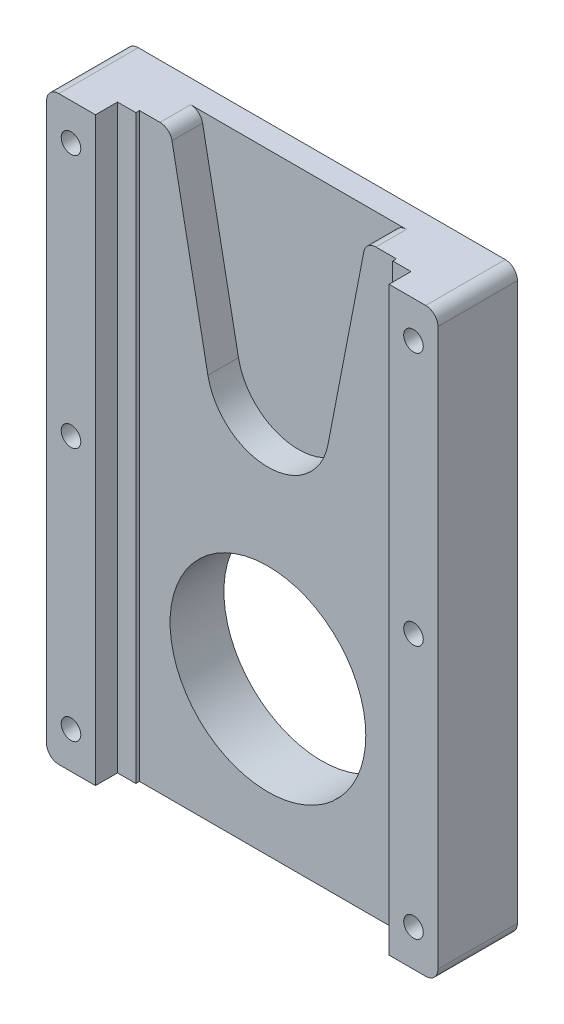
ISO-10303-21;
HEADER;
FILE_DESCRIPTION(('STEP AP214'),'2;1');
FILE_NAME('part.step','',(''),(''),'','','');
FILE_SCHEMA(('AUTOMOTIVE_DESIGN { 1 0 10303 214 1 1 1 1 }'));
ENDSEC;
DATA;
#1=APPLICATION_CONTEXT('core data for automotive mechanical design processes');
#2=APPLICATION_PROTOCOL_DEFINITION('international standard','automotive_design',2000,#1);
#3=PRODUCT_CONTEXT('',#1,'mechanical');
#4=PRODUCT('Part','Part','',(#3));
#5=PRODUCT_RELATED_PRODUCT_CATEGORY('part','',(#4));
#6=PRODUCT_DEFINITION_FORMATION('','',#4);
#7=PRODUCT_DEFINITION_CONTEXT('part definition',#1,'design');
#8=PRODUCT_DEFINITION('design','',#6,#7);
#9=PRODUCT_DEFINITION_SHAPE('','',#8);
#10=(LENGTH_UNIT() NAMED_UNIT(*) SI_UNIT(.MILLI.,.METRE.));
#11=(NAMED_UNIT(*) PLANE_ANGLE_UNIT() SI_UNIT($,.RADIAN.));
#12=(NAMED_UNIT(*) SI_UNIT($,.STERADIAN.) SOLID_ANGLE_UNIT());
#13=UNCERTAINTY_MEASURE_WITH_UNIT(LENGTH_MEASURE(1.E-05),#10,'distance_accuracy_value','');
#14=(GEOMETRIC_REPRESENTATION_CONTEXT(3) GLOBAL_UNCERTAINTY_ASSIGNED_CONTEXT((#13)) GLOBAL_UNIT_ASSIGNED_CONTEXT((#10,
#11,#12)) REPRESENTATION_CONTEXT('',''));
#15=CARTESIAN_POINT('',(0.,0.,0.));
#16=DIRECTION('',(0.,0.,1.));
#17=DIRECTION('',(1.,0.,0.));
#18=AXIS2_PLACEMENT_3D('',#15,#16,#17);
#19=CARTESIAN_POINT('',(0.,0.,-12.));
#20=DIRECTION('',(0.,0.,1.));
#21=DIRECTION('',(1.,0.,0.));
#22=AXIS2_PLACEMENT_3D('',#19,#20,#21);
#23=CYLINDRICAL_SURFACE('',#22,16.);
#24=CARTESIAN_POINT('',(0.,0.,-12.));
#25=DIRECTION('',(0.,0.,1.));
#26=DIRECTION('',(1.,0.,0.));
#27=AXIS2_PLACEMENT_3D('',#24,#25,#26);
#28=CIRCLE('',#27,16.);
#29=CARTESIAN_POINT('',(16.,0.,-12.));
#30=VERTEX_POINT('',#29);
#31=EDGE_CURVE('E340',#30,#30,#28,.T.);
#32=ORIENTED_EDGE('',*,*,#31,.F.);
#33=EDGE_LOOP('',(#32));
#34=FACE_BOUND('',#33,.T.);
#35=CARTESIAN_POINT('',(0.,0.,-3.2));
#36=DIRECTION('',(0.,0.,1.));
#37=DIRECTION('',(1.,0.,0.));
#38=AXIS2_PLACEMENT_3D('',#35,#36,#37);
#39=CIRCLE('',#38,16.);
#40=CARTESIAN_POINT('',(16.,0.,-3.2));
#41=VERTEX_POINT('',#40);
#42=EDGE_CURVE('E313',#41,#41,#39,.F.);
#43=ORIENTED_EDGE('',*,*,#42,.F.);
#44=EDGE_LOOP('',(#43));
#45=FACE_BOUND('',#44,.T.);
#46=ADVANCED_FACE('F35',(#34,#45),#23,.F.);
#47=CARTESIAN_POINT('',(0.,0.,-2.6));
#48=DIRECTION('',(0.,0.,1.));
#49=DIRECTION('',(1.,0.,0.));
#50=AXIS2_PLACEMENT_3D('',#47,#48,#49);
#51=PLANE('',#50);
#52=DIRECTION('',(0.,-1.,0.));
#53=VECTOR('',#52,1.);
#54=CARTESIAN_POINT('',(-21.,70.,-2.6));
#55=LINE('',#54,#53);
#56=CARTESIAN_POINT('',(-21.,70.,-2.6));
#57=VERTEX_POINT('',#56);
#58=CARTESIAN_POINT('',(-21.,-25.,-2.6));
#59=VERTEX_POINT('',#58);
#60=EDGE_CURVE('E288',#57,#59,#55,.T.);
#61=ORIENTED_EDGE('',*,*,#60,.F.);
#62=DIRECTION('',(-1.,0.,0.));
#63=VECTOR('',#62,1.);
#64=CARTESIAN_POINT('',(-24.,70.,-2.6));
#65=LINE('',#64,#63);
#66=CARTESIAN_POINT('',(-24.,70.,-2.6));
#67=VERTEX_POINT('',#66);
#68=EDGE_CURVE('E333',#57,#67,#65,.T.);
#69=ORIENTED_EDGE('',*,*,#68,.T.);
#70=DIRECTION('',(0.,-1.,0.));
#71=VECTOR('',#70,1.);
#72=CARTESIAN_POINT('',(-24.,70.,-2.6));
#73=LINE('',#72,#71);
#74=CARTESIAN_POINT('',(-24.,-25.,-2.6));
#75=VERTEX_POINT('',#74);
#76=EDGE_CURVE('E323',#67,#75,#73,.T.);
#77=ORIENTED_EDGE('',*,*,#76,.T.);
#78=DIRECTION('',(1.,0.,0.));
#79=VECTOR('',#78,1.);
#80=CARTESIAN_POINT('',(-24.,-25.,-2.6));
#81=LINE('',#80,#79);
#82=EDGE_CURVE('E327',#75,#59,#81,.T.);
#83=ORIENTED_EDGE('',*,*,#82,.T.);
#84=EDGE_LOOP('',(#61,#69,#77,#83));
#85=FACE_BOUND('',#84,.T.);
#86=ADVANCED_FACE('F450',(#85),#51,.T.);
#87=CARTESIAN_POINT('',(-32.,70.,-12.));
#88=DIRECTION('',(-1.,0.,0.));
#89=DIRECTION('',(0.,-1.,0.));
#90=AXIS2_PLACEMENT_3D('',#87,#88,#89);
#91=PLANE('',#90);
#92=DIRECTION('',(0.,-1.,0.));
#93=VECTOR('',#92,1.);
#94=CARTESIAN_POINT('',(-32.,70.,-12.));
#95=LINE('',#94,#93);
#96=CARTESIAN_POINT('',(-32.,68.,-12.));
#97=VERTEX_POINT('',#96);
#98=CARTESIAN_POINT('',(-32.,-23.,-12.));
#99=VERTEX_POINT('',#98);
#100=EDGE_CURVE('E348',#97,#99,#95,.T.);
#101=ORIENTED_EDGE('',*,*,#100,.T.);
#102=DIRECTION('',(0.,0.,1.));
#103=VECTOR('',#102,1.);
#104=CARTESIAN_POINT('',(-32.,-23.,-12.));
#105=LINE('',#104,#103);
#106=CARTESIAN_POINT('',(-32.,-23.,1.));
#107=VERTEX_POINT('',#106);
#108=EDGE_CURVE('E193',#99,#107,#105,.T.);
#109=ORIENTED_EDGE('',*,*,#108,.T.);
#110=DIRECTION('',(0.,-1.,0.));
#111=VECTOR('',#110,1.);
#112=CARTESIAN_POINT('',(-32.,68.,1.));
#113=LINE('',#112,#111);
#114=CARTESIAN_POINT('',(-32.,68.,1.));
#115=VERTEX_POINT('',#114);
#116=EDGE_CURVE('E197',#115,#107,#113,.T.);
#117=ORIENTED_EDGE('',*,*,#116,.F.);
#118=DIRECTION('',(0.,0.,1.));
#119=VECTOR('',#118,1.);
#120=CARTESIAN_POINT('',(-32.,68.,-12.));
#121=LINE('',#120,#119);
#122=EDGE_CURVE('E184',#115,#97,#121,.F.);
#123=ORIENTED_EDGE('',*,*,#122,.T.);
#124=EDGE_LOOP('',(#101,#109,#117,#123));
#125=FACE_BOUND('',#124,.T.);
#126=ADVANCED_FACE('F198',(#125),#91,.T.);
#127=CARTESIAN_POINT('',(-32.,70.,-12.));
#128=DIRECTION('',(0.,1.,0.));
#129=DIRECTION('',(-1.,0.,0.));
#130=AXIS2_PLACEMENT_3D('',#127,#128,#129);
#131=PLANE('',#130);
#132=DIRECTION('',(-1.,0.,0.));
#133=VECTOR('',#132,1.);
#134=CARTESIAN_POINT('',(-16.,70.,-8.2));
#135=LINE('',#134,#133);
#136=CARTESIAN_POINT('',(17.6496153618544,70.,-8.2));
#137=VERTEX_POINT('',#136);
#138=CARTESIAN_POINT('',(-17.6496153618544,70.,-8.2));
#139=VERTEX_POINT('',#138);
#140=EDGE_CURVE('E253',#137,#139,#135,.T.);
#141=ORIENTED_EDGE('',*,*,#140,.F.);
#142=DIRECTION('',(0.,0.,1.));
#143=VECTOR('',#142,1.);
#144=CARTESIAN_POINT('',(17.6496153618544,70.,-3.2));
#145=LINE('',#144,#143);
#146=CARTESIAN_POINT('',(17.6496153618544,70.,-3.2));
#147=VERTEX_POINT('',#146);
#148=EDGE_CURVE('E365',#137,#147,#145,.T.);
#149=ORIENTED_EDGE('',*,*,#148,.T.);
#150=DIRECTION('',(-1.,0.,0.));
#151=VECTOR('',#150,1.);
#152=CARTESIAN_POINT('',(-21.,70.,-3.2));
#153=LINE('',#152,#151);
#154=CARTESIAN_POINT('',(21.,70.,-3.2));
#155=VERTEX_POINT('',#154);
#156=EDGE_CURVE('E305',#155,#147,#153,.T.);
#157=ORIENTED_EDGE('',*,*,#156,.F.);
#158=DIRECTION('',(0.,0.,1.));
#159=VECTOR('',#158,1.);
#160=CARTESIAN_POINT('',(21.,70.,-3.2));
#161=LINE('',#160,#159);
#162=CARTESIAN_POINT('',(21.,70.,-2.6));
#163=VERTEX_POINT('',#162);
#164=EDGE_CURVE('E314',#155,#163,#161,.T.);
#165=ORIENTED_EDGE('',*,*,#164,.T.);
#166=CARTESIAN_POINT('',(24.,70.,-2.6));
#167=VERTEX_POINT('',#166);
#168=EDGE_CURVE('E334',#167,#163,#65,.T.);
#169=ORIENTED_EDGE('',*,*,#168,.F.);
#170=DIRECTION('',(0.,0.,1.));
#171=VECTOR('',#170,1.);
#172=CARTESIAN_POINT('',(24.,70.,-2.6));
#173=LINE('',#172,#171);
#174=CARTESIAN_POINT('',(24.,70.,1.));
#175=VERTEX_POINT('',#174);
#176=EDGE_CURVE('E341',#167,#175,#173,.T.);
#177=ORIENTED_EDGE('',*,*,#176,.T.);
#178=DIRECTION('',(-1.,0.,0.));
#179=VECTOR('',#178,1.);
#180=CARTESIAN_POINT('',(30.,70.,1.));
#181=LINE('',#180,#179);
#182=CARTESIAN_POINT('',(30.,70.,1.));
#183=VERTEX_POINT('',#182);
#184=EDGE_CURVE('E243',#183,#175,#181,.T.);
#185=ORIENTED_EDGE('',*,*,#184,.F.);
#186=DIRECTION('',(0.,0.,1.));
#187=VECTOR('',#186,1.);
#188=CARTESIAN_POINT('',(30.,70.,-12.));
#189=LINE('',#188,#187);
#190=CARTESIAN_POINT('',(30.,70.,-12.));
#191=VERTEX_POINT('',#190);
#192=EDGE_CURVE('E360',#183,#191,#189,.F.);
#193=ORIENTED_EDGE('',*,*,#192,.T.);
#194=DIRECTION('',(-1.,0.,0.));
#195=VECTOR('',#194,1.);
#196=CARTESIAN_POINT('',(-32.,70.,-12.));
#197=LINE('',#196,#195);
#198=CARTESIAN_POINT('',(-30.,70.,-12.));
#199=VERTEX_POINT('',#198);
#200=EDGE_CURVE('E355',#191,#199,#197,.T.);
#201=ORIENTED_EDGE('',*,*,#200,.T.);
#202=DIRECTION('',(0.,0.,1.));
#203=VECTOR('',#202,1.);
#204=CARTESIAN_POINT('',(-30.,70.,-12.));
#205=LINE('',#204,#203);
#206=CARTESIAN_POINT('',(-30.,70.,1.));
#207=VERTEX_POINT('',#206);
#208=EDGE_CURVE('E358',#199,#207,#205,.T.);
#209=ORIENTED_EDGE('',*,*,#208,.T.);
#210=DIRECTION('',(-1.,0.,0.));
#211=VECTOR('',#210,1.);
#212=CARTESIAN_POINT('',(-24.,70.,1.));
#213=LINE('',#212,#211);
#214=CARTESIAN_POINT('',(-24.,70.,1.));
#215=VERTEX_POINT('',#214);
#216=EDGE_CURVE('E210',#215,#207,#213,.T.);
#217=ORIENTED_EDGE('',*,*,#216,.F.);
#218=DIRECTION('',(0.,0.,1.));
#219=VECTOR('',#218,1.);
#220=CARTESIAN_POINT('',(-24.,70.,-2.6));
#221=LINE('',#220,#219);
#222=EDGE_CURVE('E338',#67,#215,#221,.T.);
#223=ORIENTED_EDGE('',*,*,#222,.F.);
#224=ORIENTED_EDGE('',*,*,#68,.F.);
#225=DIRECTION('',(0.,0.,1.));
#226=VECTOR('',#225,1.);
#227=CARTESIAN_POINT('',(-21.,70.,-3.2));
#228=LINE('',#227,#226);
#229=CARTESIAN_POINT('',(-21.,70.,-3.2));
#230=VERTEX_POINT('',#229);
#231=EDGE_CURVE('E311',#230,#57,#228,.T.);
#232=ORIENTED_EDGE('',*,*,#231,.F.);
#233=CARTESIAN_POINT('',(-17.6496153618544,70.,-3.2));
#234=VERTEX_POINT('',#233);
#235=EDGE_CURVE('E304',#234,#230,#153,.T.);
#236=ORIENTED_EDGE('',*,*,#235,.F.);
#237=DIRECTION('',(0.,0.,1.));
#238=VECTOR('',#237,1.);
#239=CARTESIAN_POINT('',(-17.6496153618544,70.,-8.2));
#240=LINE('',#239,#238);
#241=EDGE_CURVE('E362',#234,#139,#240,.F.);
#242=ORIENTED_EDGE('',*,*,#241,.T.);
#243=EDGE_LOOP('',(#141,#149,#157,#165,#169,#177,#185,#193,#201,#209,#217,#223,#224,#232,#236,#242));
#244=FACE_BOUND('',#243,.T.);
#245=ADVANCED_FACE('F400',(#244),#131,.T.);
#246=CARTESIAN_POINT('',(32.,70.,-12.));
#247=DIRECTION('',(1.,0.,0.));
#248=DIRECTION('',(0.,1.,0.));
#249=AXIS2_PLACEMENT_3D('',#246,#247,#248);
#250=PLANE('',#249);
#251=DIRECTION('',(0.,1.,0.));
#252=VECTOR('',#251,1.);
#253=CARTESIAN_POINT('',(32.,70.,-12.));
#254=LINE('',#253,#252);
#255=CARTESIAN_POINT('',(32.,-23.,-12.));
#256=VERTEX_POINT('',#255);
#257=CARTESIAN_POINT('',(32.,68.,-12.));
#258=VERTEX_POINT('',#257);
#259=EDGE_CURVE('E352',#256,#258,#254,.T.);
#260=ORIENTED_EDGE('',*,*,#259,.T.);
#261=DIRECTION('',(0.,0.,1.));
#262=VECTOR('',#261,1.);
#263=CARTESIAN_POINT('',(32.,68.,-12.));
#264=LINE('',#263,#262);
#265=CARTESIAN_POINT('',(32.,68.,1.));
#266=VERTEX_POINT('',#265);
#267=EDGE_CURVE('E379',#258,#266,#264,.T.);
#268=ORIENTED_EDGE('',*,*,#267,.T.);
#269=DIRECTION('',(0.,1.,0.));
#270=VECTOR('',#269,1.);
#271=CARTESIAN_POINT('',(32.,-23.,1.));
#272=LINE('',#271,#270);
#273=CARTESIAN_POINT('',(32.,-23.,1.));
#274=VERTEX_POINT('',#273);
#275=EDGE_CURVE('E237',#274,#266,#272,.T.);
#276=ORIENTED_EDGE('',*,*,#275,.F.);
#277=DIRECTION('',(0.,0.,1.));
#278=VECTOR('',#277,1.);
#279=CARTESIAN_POINT('',(32.,-23.,-12.));
#280=LINE('',#279,#278);
#281=EDGE_CURVE('E377',#274,#256,#280,.F.);
#282=ORIENTED_EDGE('',*,*,#281,.T.);
#283=EDGE_LOOP('',(#260,#268,#276,#282));
#284=FACE_BOUND('',#283,.T.);
#285=ADVANCED_FACE('F430',(#284),#250,.T.);
#286=CARTESIAN_POINT('',(-32.,-25.,-12.));
#287=DIRECTION('',(0.,-1.,0.));
#288=DIRECTION('',(1.,0.,0.));
#289=AXIS2_PLACEMENT_3D('',#286,#287,#288);
#290=PLANE('',#289);
#291=DIRECTION('',(1.,0.,0.));
#292=VECTOR('',#291,1.);
#293=CARTESIAN_POINT('',(-32.,-25.,-12.));
#294=LINE('',#293,#292);
#295=CARTESIAN_POINT('',(-30.,-25.,-12.));
#296=VERTEX_POINT('',#295);
#297=CARTESIAN_POINT('',(30.,-25.,-12.));
#298=VERTEX_POINT('',#297);
#299=EDGE_CURVE('E350',#296,#298,#294,.T.);
#300=ORIENTED_EDGE('',*,*,#299,.T.);
#301=DIRECTION('',(0.,0.,1.));
#302=VECTOR('',#301,1.);
#303=CARTESIAN_POINT('',(30.,-25.,-12.));
#304=LINE('',#303,#302);
#305=CARTESIAN_POINT('',(30.,-25.,1.));
#306=VERTEX_POINT('',#305);
#307=EDGE_CURVE('E194',#298,#306,#304,.T.);
#308=ORIENTED_EDGE('',*,*,#307,.T.);
#309=DIRECTION('',(1.,0.,0.));
#310=VECTOR('',#309,1.);
#311=CARTESIAN_POINT('',(24.,-25.,1.));
#312=LINE('',#311,#310);
#313=CARTESIAN_POINT('',(24.,-25.,1.));
#314=VERTEX_POINT('',#313);
#315=EDGE_CURVE('E249',#314,#306,#312,.T.);
#316=ORIENTED_EDGE('',*,*,#315,.F.);
#317=DIRECTION('',(0.,0.,1.));
#318=VECTOR('',#317,1.);
#319=CARTESIAN_POINT('',(24.,-25.,-2.6));
#320=LINE('',#319,#318);
#321=CARTESIAN_POINT('',(24.,-25.,-2.6));
#322=VERTEX_POINT('',#321);
#323=EDGE_CURVE('E343',#322,#314,#320,.T.);
#324=ORIENTED_EDGE('',*,*,#323,.F.);
#325=CARTESIAN_POINT('',(21.,-25.,-2.6));
#326=VERTEX_POINT('',#325);
#327=EDGE_CURVE('E326',#326,#322,#81,.T.);
#328=ORIENTED_EDGE('',*,*,#327,.F.);
#329=DIRECTION('',(0.,0.,1.));
#330=VECTOR('',#329,1.);
#331=CARTESIAN_POINT('',(21.,-25.,-3.2));
#332=LINE('',#331,#330);
#333=CARTESIAN_POINT('',(21.,-25.,-3.2));
#334=VERTEX_POINT('',#333);
#335=EDGE_CURVE('E317',#334,#326,#332,.T.);
#336=ORIENTED_EDGE('',*,*,#335,.F.);
#337=DIRECTION('',(1.,0.,0.));
#338=VECTOR('',#337,1.);
#339=CARTESIAN_POINT('',(-21.,-25.,-3.2));
#340=LINE('',#339,#338);
#341=CARTESIAN_POINT('',(-21.,-25.,-3.2));
#342=VERTEX_POINT('',#341);
#343=EDGE_CURVE('E297',#342,#334,#340,.T.);
#344=ORIENTED_EDGE('',*,*,#343,.F.);
#345=DIRECTION('',(0.,0.,1.));
#346=VECTOR('',#345,1.);
#347=CARTESIAN_POINT('',(-21.,-25.,-3.2));
#348=LINE('',#347,#346);
#349=EDGE_CURVE('E308',#342,#59,#348,.T.);
#350=ORIENTED_EDGE('',*,*,#349,.T.);
#351=ORIENTED_EDGE('',*,*,#82,.F.);
#352=DIRECTION('',(0.,0.,1.));
#353=VECTOR('',#352,1.);
#354=CARTESIAN_POINT('',(-24.,-25.,-2.6));
#355=LINE('',#354,#353);
#356=CARTESIAN_POINT('',(-24.,-25.,1.));
#357=VERTEX_POINT('',#356);
#358=EDGE_CURVE('E337',#75,#357,#355,.T.);
#359=ORIENTED_EDGE('',*,*,#358,.T.);
#360=DIRECTION('',(1.,0.,0.));
#361=VECTOR('',#360,1.);
#362=CARTESIAN_POINT('',(-30.,-25.,1.));
#363=LINE('',#362,#361);
#364=CARTESIAN_POINT('',(-30.,-25.,1.));
#365=VERTEX_POINT('',#364);
#366=EDGE_CURVE('E219',#365,#357,#363,.T.);
#367=ORIENTED_EDGE('',*,*,#366,.F.);
#368=DIRECTION('',(0.,0.,1.));
#369=VECTOR('',#368,1.);
#370=CARTESIAN_POINT('',(-30.,-25.,-12.));
#371=LINE('',#370,#369);
#372=EDGE_CURVE('E57',#365,#296,#371,.F.);
#373=ORIENTED_EDGE('',*,*,#372,.T.);
#374=EDGE_LOOP('',(#300,#308,#316,#324,#328,#336,#344,#350,#351,#359,#367,#373));
#375=FACE_BOUND('',#374,.T.);
#376=ADVANCED_FACE('F420',(#375),#290,.T.);
#377=CARTESIAN_POINT('',(0.,0.,-12.));
#378=DIRECTION('',(0.,0.,1.));
#379=DIRECTION('',(1.,0.,0.));
#380=AXIS2_PLACEMENT_3D('',#377,#378,#379);
#381=PLANE('',#380);
#382=CARTESIAN_POINT('',(28.,-19.,-12.));
#383=DIRECTION('',(0.,0.,-1.));
#384=DIRECTION('',(-1.,0.,0.));
#385=AXIS2_PLACEMENT_3D('',#382,#383,#384);
#386=CIRCLE('',#385,1.6);
#387=CARTESIAN_POINT('',(26.4,-19.,-12.));
#388=VERTEX_POINT('',#387);
#389=EDGE_CURVE('E276',#388,#388,#386,.T.);
#390=ORIENTED_EDGE('',*,*,#389,.F.);
#391=EDGE_LOOP('',(#390));
#392=FACE_BOUND('',#391,.T.);
#393=CARTESIAN_POINT('',(28.,22.5,-12.));
#394=DIRECTION('',(0.,0.,-1.));
#395=DIRECTION('',(-1.,0.,0.));
#396=AXIS2_PLACEMENT_3D('',#393,#394,#395);
#397=CIRCLE('',#396,1.6);
#398=CARTESIAN_POINT('',(26.4,22.5,-12.));
#399=VERTEX_POINT('',#398);
#400=EDGE_CURVE('E280',#399,#399,#397,.T.);
#401=ORIENTED_EDGE('',*,*,#400,.F.);
#402=EDGE_LOOP('',(#401));
#403=FACE_BOUND('',#402,.T.);
#404=CARTESIAN_POINT('',(28.,64.,-12.));
#405=DIRECTION('',(0.,0.,-1.));
#406=DIRECTION('',(-1.,0.,0.));
#407=AXIS2_PLACEMENT_3D('',#404,#405,#406);
#408=CIRCLE('',#407,1.6);
#409=CARTESIAN_POINT('',(26.4,64.,-12.));
#410=VERTEX_POINT('',#409);
#411=EDGE_CURVE('E273',#410,#410,#408,.T.);
#412=ORIENTED_EDGE('',*,*,#411,.F.);
#413=EDGE_LOOP('',(#412));
#414=FACE_BOUND('',#413,.T.);
#415=CARTESIAN_POINT('',(-28.,-19.,-12.));
#416=DIRECTION('',(0.,0.,1.));
#417=DIRECTION('',(1.,0.,0.));
#418=AXIS2_PLACEMENT_3D('',#415,#416,#417);
#419=CIRCLE('',#418,1.6);
#420=CARTESIAN_POINT('',(-26.4,-19.,-12.));
#421=VERTEX_POINT('',#420);
#422=EDGE_CURVE('E285',#421,#421,#419,.T.);
#423=ORIENTED_EDGE('',*,*,#422,.T.);
#424=EDGE_LOOP('',(#423));
#425=FACE_BOUND('',#424,.T.);
#426=CARTESIAN_POINT('',(-28.,22.5,-12.));
#427=DIRECTION('',(0.,0.,1.));
#428=DIRECTION('',(1.,0.,0.));
#429=AXIS2_PLACEMENT_3D('',#426,#427,#428);
#430=CIRCLE('',#429,1.6);
#431=CARTESIAN_POINT('',(-26.4,22.5,-12.));
#432=VERTEX_POINT('',#431);
#433=EDGE_CURVE('E289',#432,#432,#430,.T.);
#434=ORIENTED_EDGE('',*,*,#433,.T.);
#435=EDGE_LOOP('',(#434));
#436=FACE_BOUND('',#435,.T.);
#437=CARTESIAN_POINT('',(-28.,64.,-12.));
#438=DIRECTION('',(0.,0.,1.));
#439=DIRECTION('',(1.,0.,0.));
#440=AXIS2_PLACEMENT_3D('',#437,#438,#439);
#441=CIRCLE('',#440,1.6);
#442=CARTESIAN_POINT('',(-26.4,64.,-12.));
#443=VERTEX_POINT('',#442);
#444=EDGE_CURVE('E279',#443,#443,#441,.T.);
#445=ORIENTED_EDGE('',*,*,#444,.T.);
#446=EDGE_LOOP('',(#445));
#447=FACE_BOUND('',#446,.T.);
#448=ORIENTED_EDGE('',*,*,#31,.T.);
#449=EDGE_LOOP('',(#448));
#450=FACE_BOUND('',#449,.T.);
#451=ORIENTED_EDGE('',*,*,#200,.F.);
#452=CARTESIAN_POINT('',(30.,68.,-12.));
#453=DIRECTION('',(0.,0.,1.));
#454=DIRECTION('',(1.,0.,0.));
#455=AXIS2_PLACEMENT_3D('',#452,#453,#454);
#456=CIRCLE('',#455,2.);
#457=EDGE_CURVE('E385',#191,#258,#456,.F.);
#458=ORIENTED_EDGE('',*,*,#457,.T.);
#459=ORIENTED_EDGE('',*,*,#259,.F.);
#460=CARTESIAN_POINT('',(30.,-23.,-12.));
#461=DIRECTION('',(0.,0.,1.));
#462=DIRECTION('',(1.,0.,0.));
#463=AXIS2_PLACEMENT_3D('',#460,#461,#462);
#464=CIRCLE('',#463,2.);
#465=EDGE_CURVE('E50',#256,#298,#464,.F.);
#466=ORIENTED_EDGE('',*,*,#465,.T.);
#467=ORIENTED_EDGE('',*,*,#299,.F.);
#468=CARTESIAN_POINT('',(-30.,-23.,-12.));
#469=DIRECTION('',(0.,0.,1.));
#470=DIRECTION('',(1.,0.,0.));
#471=AXIS2_PLACEMENT_3D('',#468,#469,#470);
#472=CIRCLE('',#471,2.);
#473=EDGE_CURVE('E382',#296,#99,#472,.F.);
#474=ORIENTED_EDGE('',*,*,#473,.T.);
#475=ORIENTED_EDGE('',*,*,#100,.F.);
#476=CARTESIAN_POINT('',(-30.,68.,-12.));
#477=DIRECTION('',(0.,0.,1.));
#478=DIRECTION('',(1.,0.,0.));
#479=AXIS2_PLACEMENT_3D('',#476,#477,#478);
#480=CIRCLE('',#479,2.);
#481=EDGE_CURVE('E189',#97,#199,#480,.F.);
#482=ORIENTED_EDGE('',*,*,#481,.T.);
#483=EDGE_LOOP('',(#451,#458,#459,#466,#467,#474,#475,#482));
#484=FACE_BOUND('',#483,.T.);
#485=ADVANCED_FACE('F438',(#392,#403,#414,#425,#436,#447,#450,#484),#381,.F.);
#486=DIRECTION('',(0.,1.,0.));
#487=VECTOR('',#486,1.);
#488=CARTESIAN_POINT('',(21.,70.,-2.6));
#489=LINE('',#488,#487);
#490=EDGE_CURVE('E298',#326,#163,#489,.T.);
#491=ORIENTED_EDGE('',*,*,#490,.F.);
#492=ORIENTED_EDGE('',*,*,#327,.T.);
#493=DIRECTION('',(0.,1.,0.));
#494=VECTOR('',#493,1.);
#495=CARTESIAN_POINT('',(24.,70.,-2.6));
#496=LINE('',#495,#494);
#497=EDGE_CURVE('E330',#322,#167,#496,.T.);
#498=ORIENTED_EDGE('',*,*,#497,.T.);
#499=ORIENTED_EDGE('',*,*,#168,.T.);
#500=EDGE_LOOP('',(#491,#492,#498,#499));
#501=FACE_BOUND('',#500,.T.);
#502=ADVANCED_FACE('F412',(#501),#51,.T.);
#503=CARTESIAN_POINT('',(-24.,70.,-2.6));
#504=DIRECTION('',(-1.,0.,0.));
#505=DIRECTION('',(0.,-1.,0.));
#506=AXIS2_PLACEMENT_3D('',#503,#504,#505);
#507=PLANE('',#506);
#508=ORIENTED_EDGE('',*,*,#222,.T.);
#509=DIRECTION('',(0.,1.,0.));
#510=VECTOR('',#509,1.);
#511=CARTESIAN_POINT('',(-24.,-25.,1.));
#512=LINE('',#511,#510);
#513=EDGE_CURVE('E222',#357,#215,#512,.T.);
#514=ORIENTED_EDGE('',*,*,#513,.F.);
#515=ORIENTED_EDGE('',*,*,#358,.F.);
#516=ORIENTED_EDGE('',*,*,#76,.F.);
#517=EDGE_LOOP('',(#508,#514,#515,#516));
#518=FACE_BOUND('',#517,.T.);
#519=ADVANCED_FACE('F446',(#518),#507,.F.);
#520=CARTESIAN_POINT('',(24.,70.,-2.6));
#521=DIRECTION('',(1.,0.,0.));
#522=DIRECTION('',(0.,1.,0.));
#523=AXIS2_PLACEMENT_3D('',#520,#521,#522);
#524=PLANE('',#523);
#525=ORIENTED_EDGE('',*,*,#323,.T.);
#526=DIRECTION('',(0.,-1.,0.));
#527=VECTOR('',#526,1.);
#528=CARTESIAN_POINT('',(24.,70.,1.));
#529=LINE('',#528,#527);
#530=EDGE_CURVE('E246',#175,#314,#529,.T.);
#531=ORIENTED_EDGE('',*,*,#530,.F.);
#532=ORIENTED_EDGE('',*,*,#176,.F.);
#533=ORIENTED_EDGE('',*,*,#497,.F.);
#534=EDGE_LOOP('',(#525,#531,#532,#533));
#535=FACE_BOUND('',#534,.T.);
#536=ADVANCED_FACE('F417',(#535),#524,.F.);
#537=CARTESIAN_POINT('',(0.,0.,-3.2));
#538=DIRECTION('',(0.,0.,1.));
#539=DIRECTION('',(1.,0.,0.));
#540=AXIS2_PLACEMENT_3D('',#537,#538,#539);
#541=PLANE('',#540);
#542=ORIENTED_EDGE('',*,*,#156,.T.);
#543=CARTESIAN_POINT('',(17.6496153618544,68.,-3.2));
#544=DIRECTION('',(0.,0.,1.));
#545=DIRECTION('',(1.,0.,0.));
#546=AXIS2_PLACEMENT_3D('',#543,#544,#545);
#547=CIRCLE('',#546,2.);
#548=CARTESIAN_POINT('',(15.6861471809611,68.3805163631431,-3.2));
#549=VERTEX_POINT('',#548);
#550=EDGE_CURVE('E370',#147,#549,#547,.T.);
#551=ORIENTED_EDGE('',*,*,#550,.T.);
#552=DIRECTION('',(0.190258181571541,0.98173409044664,0.));
#553=VECTOR('',#552,1.);
#554=CARTESIAN_POINT('',(16.,70.,-3.2));
#555=LINE('',#554,#553);
#556=CARTESIAN_POINT('',(9.81734090446639,38.0974181842846,-3.2));
#557=VERTEX_POINT('',#556);
#558=EDGE_CURVE('E256',#557,#549,#555,.T.);
#559=ORIENTED_EDGE('',*,*,#558,.F.);
#560=CARTESIAN_POINT('',(0.,40.,-3.2));
#561=DIRECTION('',(0.,0.,1.));
#562=DIRECTION('',(1.,0.,0.));
#563=AXIS2_PLACEMENT_3D('',#560,#561,#562);
#564=CIRCLE('',#563,10.);
#565=CARTESIAN_POINT('',(-9.81734090446639,38.0974181842846,-3.2));
#566=VERTEX_POINT('',#565);
#567=EDGE_CURVE('E266',#566,#557,#564,.T.);
#568=ORIENTED_EDGE('',*,*,#567,.F.);
#569=DIRECTION('',(0.190258181571541,-0.98173409044664,0.));
#570=VECTOR('',#569,1.);
#571=CARTESIAN_POINT('',(-9.81734090446639,38.0974181842846,-3.2));
#572=LINE('',#571,#570);
#573=CARTESIAN_POINT('',(-15.6861471809611,68.3805163631431,-3.2));
#574=VERTEX_POINT('',#573);
#575=EDGE_CURVE('E252',#574,#566,#572,.T.);
#576=ORIENTED_EDGE('',*,*,#575,.F.);
#577=CARTESIAN_POINT('',(-17.6496153618544,68.,-3.2));
#578=DIRECTION('',(0.,0.,1.));
#579=DIRECTION('',(1.,0.,0.));
#580=AXIS2_PLACEMENT_3D('',#577,#578,#579);
#581=CIRCLE('',#580,2.);
#582=EDGE_CURVE('E368',#574,#234,#581,.T.);
#583=ORIENTED_EDGE('',*,*,#582,.T.);
#584=ORIENTED_EDGE('',*,*,#235,.T.);
#585=DIRECTION('',(0.,-1.,0.));
#586=VECTOR('',#585,1.);
#587=CARTESIAN_POINT('',(-21.,70.,-3.2));
#588=LINE('',#587,#586);
#589=EDGE_CURVE('E294',#230,#342,#588,.T.);
#590=ORIENTED_EDGE('',*,*,#589,.T.);
#591=ORIENTED_EDGE('',*,*,#343,.T.);
#592=DIRECTION('',(0.,1.,0.));
#593=VECTOR('',#592,1.);
#594=CARTESIAN_POINT('',(21.,70.,-3.2));
#595=LINE('',#594,#593);
#596=EDGE_CURVE('E301',#334,#155,#595,.T.);
#597=ORIENTED_EDGE('',*,*,#596,.T.);
#598=EDGE_LOOP('',(#542,#551,#559,#568,#576,#583,#584,#590,#591,#597));
#599=FACE_BOUND('',#598,.T.);
#600=ORIENTED_EDGE('',*,*,#42,.T.);
#601=EDGE_LOOP('',(#600));
#602=FACE_BOUND('',#601,.T.);
#603=ADVANCED_FACE('F402',(#599,#602),#541,.T.);
#604=CARTESIAN_POINT('',(-21.,70.,-3.2));
#605=DIRECTION('',(-1.,0.,0.));
#606=DIRECTION('',(0.,-1.,0.));
#607=AXIS2_PLACEMENT_3D('',#604,#605,#606);
#608=PLANE('',#607);
#609=ORIENTED_EDGE('',*,*,#60,.T.);
#610=ORIENTED_EDGE('',*,*,#349,.F.);
#611=ORIENTED_EDGE('',*,*,#589,.F.);
#612=ORIENTED_EDGE('',*,*,#231,.T.);
#613=EDGE_LOOP('',(#609,#610,#611,#612));
#614=FACE_BOUND('',#613,.T.);
#615=ADVANCED_FACE('F457',(#614),#608,.F.);
#616=CARTESIAN_POINT('',(21.,70.,-3.2));
#617=DIRECTION('',(1.,0.,0.));
#618=DIRECTION('',(0.,1.,0.));
#619=AXIS2_PLACEMENT_3D('',#616,#617,#618);
#620=PLANE('',#619);
#621=ORIENTED_EDGE('',*,*,#490,.T.);
#622=ORIENTED_EDGE('',*,*,#164,.F.);
#623=ORIENTED_EDGE('',*,*,#596,.F.);
#624=ORIENTED_EDGE('',*,*,#335,.T.);
#625=EDGE_LOOP('',(#621,#622,#623,#624));
#626=FACE_BOUND('',#625,.T.);
#627=ADVANCED_FACE('F408',(#626),#620,.F.);
#628=CARTESIAN_POINT('',(-28.,64.,-12.));
#629=DIRECTION('',(0.,0.,1.));
#630=DIRECTION('',(1.,0.,0.));
#631=AXIS2_PLACEMENT_3D('',#628,#629,#630);
#632=CYLINDRICAL_SURFACE('',#631,1.6);
#633=ORIENTED_EDGE('',*,*,#444,.F.);
#634=EDGE_LOOP('',(#633));
#635=FACE_BOUND('',#634,.T.);
#636=CARTESIAN_POINT('',(-28.,64.,1.));
#637=DIRECTION('',(0.,0.,1.));
#638=DIRECTION('',(1.,0.,0.));
#639=AXIS2_PLACEMENT_3D('',#636,#637,#638);
#640=CIRCLE('',#639,1.60000000000001);
#641=CARTESIAN_POINT('',(-26.4,64.,1.));
#642=VERTEX_POINT('',#641);
#643=EDGE_CURVE('E211',#642,#642,#640,.T.);
#644=ORIENTED_EDGE('',*,*,#643,.T.);
#645=EDGE_LOOP('',(#644));
#646=FACE_BOUND('',#645,.T.);
#647=ADVANCED_FACE('F640',(#635,#646),#632,.F.);
#648=CARTESIAN_POINT('',(-28.,22.5,-12.));
#649=DIRECTION('',(0.,0.,1.));
#650=DIRECTION('',(1.,0.,0.));
#651=AXIS2_PLACEMENT_3D('',#648,#649,#650);
#652=CYLINDRICAL_SURFACE('',#651,1.6);
#653=ORIENTED_EDGE('',*,*,#433,.F.);
#654=EDGE_LOOP('',(#653));
#655=FACE_BOUND('',#654,.T.);
#656=CARTESIAN_POINT('',(-28.,22.5,1.));
#657=DIRECTION('',(0.,0.,1.));
#658=DIRECTION('',(1.,0.,0.));
#659=AXIS2_PLACEMENT_3D('',#656,#657,#658);
#660=CIRCLE('',#659,1.6);
#661=CARTESIAN_POINT('',(-26.4,22.5,1.));
#662=VERTEX_POINT('',#661);
#663=EDGE_CURVE('E214',#662,#662,#660,.T.);
#664=ORIENTED_EDGE('',*,*,#663,.T.);
#665=EDGE_LOOP('',(#664));
#666=FACE_BOUND('',#665,.T.);
#667=ADVANCED_FACE('F646',(#655,#666),#652,.F.);
#668=CARTESIAN_POINT('',(-28.,-19.,-12.));
#669=DIRECTION('',(0.,0.,1.));
#670=DIRECTION('',(1.,0.,0.));
#671=AXIS2_PLACEMENT_3D('',#668,#669,#670);
#672=CYLINDRICAL_SURFACE('',#671,1.6);
#673=ORIENTED_EDGE('',*,*,#422,.F.);
#674=EDGE_LOOP('',(#673));
#675=FACE_BOUND('',#674,.T.);
#676=CARTESIAN_POINT('',(-28.,-19.,1.));
#677=DIRECTION('',(0.,0.,1.));
#678=DIRECTION('',(1.,0.,0.));
#679=AXIS2_PLACEMENT_3D('',#676,#677,#678);
#680=CIRCLE('',#679,1.6);
#681=CARTESIAN_POINT('',(-26.4,-19.,1.));
#682=VERTEX_POINT('',#681);
#683=EDGE_CURVE('E813',#682,#682,#680,.T.);
#684=ORIENTED_EDGE('',*,*,#683,.T.);
#685=EDGE_LOOP('',(#684));
#686=FACE_BOUND('',#685,.T.);
#687=ADVANCED_FACE('F659',(#675,#686),#672,.F.);
#688=CARTESIAN_POINT('',(28.,64.,-12.));
#689=DIRECTION('',(0.,0.,1.));
#690=DIRECTION('',(1.,0.,0.));
#691=AXIS2_PLACEMENT_3D('',#688,#689,#690);
#692=CYLINDRICAL_SURFACE('',#691,1.6);
#693=ORIENTED_EDGE('',*,*,#411,.T.);
#694=EDGE_LOOP('',(#693));
#695=FACE_BOUND('',#694,.T.);
#696=CARTESIAN_POINT('',(28.,64.,1.));
#697=DIRECTION('',(0.,0.,1.));
#698=DIRECTION('',(1.,0.,0.));
#699=AXIS2_PLACEMENT_3D('',#696,#697,#698);
#700=CIRCLE('',#699,1.60000000000001);
#701=CARTESIAN_POINT('',(29.6,64.,1.));
#702=VERTEX_POINT('',#701);
#703=EDGE_CURVE('E225',#702,#702,#700,.T.);
#704=ORIENTED_EDGE('',*,*,#703,.T.);
#705=EDGE_LOOP('',(#704));
#706=FACE_BOUND('',#705,.T.);
#707=ADVANCED_FACE('F671',(#695,#706),#692,.F.);
#708=CARTESIAN_POINT('',(28.,22.5,-12.));
#709=DIRECTION('',(0.,0.,1.));
#710=DIRECTION('',(1.,0.,0.));
#711=AXIS2_PLACEMENT_3D('',#708,#709,#710);
#712=CYLINDRICAL_SURFACE('',#711,1.6);
#713=ORIENTED_EDGE('',*,*,#400,.T.);
#714=EDGE_LOOP('',(#713));
#715=FACE_BOUND('',#714,.T.);
#716=CARTESIAN_POINT('',(28.,22.5,1.));
#717=DIRECTION('',(0.,0.,1.));
#718=DIRECTION('',(1.,0.,0.));
#719=AXIS2_PLACEMENT_3D('',#716,#717,#718);
#720=CIRCLE('',#719,1.6);
#721=CARTESIAN_POINT('',(29.6,22.5,1.));
#722=VERTEX_POINT('',#721);
#723=EDGE_CURVE('E228',#722,#722,#720,.T.);
#724=ORIENTED_EDGE('',*,*,#723,.T.);
#725=EDGE_LOOP('',(#724));
#726=FACE_BOUND('',#725,.T.);
#727=ADVANCED_FACE('F683',(#715,#726),#712,.F.);
#728=CARTESIAN_POINT('',(28.,-19.,-12.));
#729=DIRECTION('',(0.,0.,1.));
#730=DIRECTION('',(1.,0.,0.));
#731=AXIS2_PLACEMENT_3D('',#728,#729,#730);
#732=CYLINDRICAL_SURFACE('',#731,1.6);
#733=ORIENTED_EDGE('',*,*,#389,.T.);
#734=EDGE_LOOP('',(#733));
#735=FACE_BOUND('',#734,.T.);
#736=CARTESIAN_POINT('',(28.,-19.,1.));
#737=DIRECTION('',(0.,0.,1.));
#738=DIRECTION('',(1.,0.,0.));
#739=AXIS2_PLACEMENT_3D('',#736,#737,#738);
#740=CIRCLE('',#739,1.6);
#741=CARTESIAN_POINT('',(29.6,-19.,1.));
#742=VERTEX_POINT('',#741);
#743=EDGE_CURVE('E231',#742,#742,#740,.T.);
#744=ORIENTED_EDGE('',*,*,#743,.T.);
#745=EDGE_LOOP('',(#744));
#746=FACE_BOUND('',#745,.T.);
#747=ADVANCED_FACE('F480',(#735,#746),#732,.F.);
#748=CARTESIAN_POINT('',(16.,70.,-8.2));
#749=DIRECTION('',(0.98173409044664,-0.190258181571541,0.));
#750=DIRECTION('',(0.190258181571541,0.98173409044664,0.));
#751=AXIS2_PLACEMENT_3D('',#748,#749,#750);
#752=PLANE('',#751);
#753=ORIENTED_EDGE('',*,*,#558,.T.);
#754=DIRECTION('',(0.,0.,1.));
#755=VECTOR('',#754,1.);
#756=CARTESIAN_POINT('',(15.6861471809611,68.3805163631431,-8.2));
#757=LINE('',#756,#755);
#758=CARTESIAN_POINT('',(15.6861471809611,68.3805163631431,-8.2));
#759=VERTEX_POINT('',#758);
#760=EDGE_CURVE('E372',#549,#759,#757,.F.);
#761=ORIENTED_EDGE('',*,*,#760,.T.);
#762=DIRECTION('',(0.190258181571541,0.98173409044664,0.));
#763=VECTOR('',#762,1.);
#764=CARTESIAN_POINT('',(16.,70.,-8.2));
#765=LINE('',#764,#763);
#766=CARTESIAN_POINT('',(9.81734090446639,38.0974181842846,-8.2));
#767=VERTEX_POINT('',#766);
#768=EDGE_CURVE('E261',#767,#759,#765,.T.);
#769=ORIENTED_EDGE('',*,*,#768,.F.);
#770=DIRECTION('',(0.,0.,1.));
#771=VECTOR('',#770,1.);
#772=CARTESIAN_POINT('',(9.81734090446639,38.0974181842846,-8.2));
#773=LINE('',#772,#771);
#774=EDGE_CURVE('E271',#767,#557,#773,.T.);
#775=ORIENTED_EDGE('',*,*,#774,.T.);
#776=EDGE_LOOP('',(#753,#761,#769,#775));
#777=FACE_BOUND('',#776,.T.);
#778=ADVANCED_FACE('F471',(#777),#752,.F.);
#779=CARTESIAN_POINT('',(0.,40.,-8.2));
#780=DIRECTION('',(0.,0.,1.));
#781=DIRECTION('',(1.,0.,0.));
#782=AXIS2_PLACEMENT_3D('',#779,#780,#781);
#783=CYLINDRICAL_SURFACE('',#782,10.);
#784=ORIENTED_EDGE('',*,*,#567,.T.);
#785=ORIENTED_EDGE('',*,*,#774,.F.);
#786=CARTESIAN_POINT('',(0.,40.,-8.2));
#787=DIRECTION('',(0.,0.,1.));
#788=DIRECTION('',(1.,0.,0.));
#789=AXIS2_PLACEMENT_3D('',#786,#787,#788);
#790=CIRCLE('',#789,10.);
#791=CARTESIAN_POINT('',(-9.81734090446639,38.0974181842846,-8.2));
#792=VERTEX_POINT('',#791);
#793=EDGE_CURVE('E258',#792,#767,#790,.T.);
#794=ORIENTED_EDGE('',*,*,#793,.F.);
#795=DIRECTION('',(0.,0.,1.));
#796=VECTOR('',#795,1.);
#797=CARTESIAN_POINT('',(-9.81734090446639,38.0974181842846,-8.2));
#798=LINE('',#797,#796);
#799=EDGE_CURVE('E264',#792,#566,#798,.T.);
#800=ORIENTED_EDGE('',*,*,#799,.T.);
#801=EDGE_LOOP('',(#784,#785,#794,#800));
#802=FACE_BOUND('',#801,.T.);
#803=ADVANCED_FACE('F472',(#802),#783,.F.);
#804=CARTESIAN_POINT('',(-9.81734090446639,38.0974181842846,-8.2));
#805=DIRECTION('',(-0.98173409044664,-0.190258181571541,0.));
#806=DIRECTION('',(0.190258181571541,-0.98173409044664,0.));
#807=AXIS2_PLACEMENT_3D('',#804,#805,#806);
#808=PLANE('',#807);
#809=DIRECTION('',(0.190258181571541,-0.98173409044664,0.));
#810=VECTOR('',#809,1.);
#811=CARTESIAN_POINT('',(-9.81734090446639,38.0974181842846,-8.2));
#812=LINE('',#811,#810);
#813=CARTESIAN_POINT('',(-15.6861471809611,68.3805163631431,-8.2));
#814=VERTEX_POINT('',#813);
#815=EDGE_CURVE('E255',#814,#792,#812,.T.);
#816=ORIENTED_EDGE('',*,*,#815,.F.);
#817=DIRECTION('',(0.,0.,1.));
#818=VECTOR('',#817,1.);
#819=CARTESIAN_POINT('',(-15.6861471809611,68.3805163631431,-3.2));
#820=LINE('',#819,#818);
#821=EDGE_CURVE('E374',#814,#574,#820,.T.);
#822=ORIENTED_EDGE('',*,*,#821,.T.);
#823=ORIENTED_EDGE('',*,*,#575,.T.);
#824=ORIENTED_EDGE('',*,*,#799,.F.);
#825=EDGE_LOOP('',(#816,#822,#823,#824));
#826=FACE_BOUND('',#825,.T.);
#827=ADVANCED_FACE('F466',(#826),#808,.F.);
#828=CARTESIAN_POINT('',(0.,40.,-8.2));
#829=DIRECTION('',(0.,0.,1.));
#830=DIRECTION('',(1.,0.,0.));
#831=AXIS2_PLACEMENT_3D('',#828,#829,#830);
#832=PLANE('',#831);
#833=ORIENTED_EDGE('',*,*,#140,.T.);
#834=CARTESIAN_POINT('',(-17.6496153618544,68.,-8.2));
#835=DIRECTION('',(0.,0.,1.));
#836=DIRECTION('',(1.,0.,0.));
#837=AXIS2_PLACEMENT_3D('',#834,#835,#836);
#838=CIRCLE('',#837,2.);
#839=EDGE_CURVE('E11',#139,#814,#838,.F.);
#840=ORIENTED_EDGE('',*,*,#839,.T.);
#841=ORIENTED_EDGE('',*,*,#815,.T.);
#842=ORIENTED_EDGE('',*,*,#793,.T.);
#843=ORIENTED_EDGE('',*,*,#768,.T.);
#844=CARTESIAN_POINT('',(17.6496153618544,68.,-8.2));
#845=DIRECTION('',(0.,0.,1.));
#846=DIRECTION('',(1.,0.,0.));
#847=AXIS2_PLACEMENT_3D('',#844,#845,#846);
#848=CIRCLE('',#847,2.);
#849=EDGE_CURVE('E43',#759,#137,#848,.F.);
#850=ORIENTED_EDGE('',*,*,#849,.T.);
#851=EDGE_LOOP('',(#833,#840,#841,#842,#843,#850));
#852=FACE_BOUND('',#851,.T.);
#853=ADVANCED_FACE('F393',(#852),#832,.T.);
#854=CARTESIAN_POINT('',(17.6496153618544,68.,-12.));
#855=DIRECTION('',(0.,0.,-1.));
#856=DIRECTION('',(-1.,0.,0.));
#857=AXIS2_PLACEMENT_3D('',#854,#855,#856);
#858=CYLINDRICAL_SURFACE('',#857,2.);
#859=ORIENTED_EDGE('',*,*,#849,.F.);
#860=ORIENTED_EDGE('',*,*,#760,.F.);
#861=ORIENTED_EDGE('',*,*,#550,.F.);
#862=ORIENTED_EDGE('',*,*,#148,.F.);
#863=EDGE_LOOP('',(#859,#860,#861,#862));
#864=FACE_BOUND('',#863,.T.);
#865=ADVANCED_FACE('F397',(#864),#858,.T.);
#866=CARTESIAN_POINT('',(-17.6496153618544,68.,-8.2));
#867=DIRECTION('',(0.,0.,-1.));
#868=DIRECTION('',(-1.,0.,0.));
#869=AXIS2_PLACEMENT_3D('',#866,#867,#868);
#870=CYLINDRICAL_SURFACE('',#869,2.);
#871=ORIENTED_EDGE('',*,*,#839,.F.);
#872=ORIENTED_EDGE('',*,*,#241,.F.);
#873=ORIENTED_EDGE('',*,*,#582,.F.);
#874=ORIENTED_EDGE('',*,*,#821,.F.);
#875=EDGE_LOOP('',(#871,#872,#873,#874));
#876=FACE_BOUND('',#875,.T.);
#877=ADVANCED_FACE('F463',(#876),#870,.T.);
#878=CARTESIAN_POINT('',(30.,68.,-12.));
#879=DIRECTION('',(0.,0.,1.));
#880=DIRECTION('',(1.,0.,0.));
#881=AXIS2_PLACEMENT_3D('',#878,#879,#880);
#882=CYLINDRICAL_SURFACE('',#881,2.);
#883=ORIENTED_EDGE('',*,*,#457,.F.);
#884=ORIENTED_EDGE('',*,*,#192,.F.);
#885=CARTESIAN_POINT('',(30.,68.,1.));
#886=DIRECTION('',(0.,0.,1.));
#887=DIRECTION('',(1.,0.,0.));
#888=AXIS2_PLACEMENT_3D('',#885,#886,#887);
#889=CIRCLE('',#888,2.);
#890=EDGE_CURVE('E240',#266,#183,#889,.T.);
#891=ORIENTED_EDGE('',*,*,#890,.F.);
#892=ORIENTED_EDGE('',*,*,#267,.F.);
#893=EDGE_LOOP('',(#883,#884,#891,#892));
#894=FACE_BOUND('',#893,.T.);
#895=ADVANCED_FACE('F436',(#894),#882,.T.);
#896=CARTESIAN_POINT('',(30.,-23.,-12.));
#897=DIRECTION('',(0.,0.,1.));
#898=DIRECTION('',(1.,0.,0.));
#899=AXIS2_PLACEMENT_3D('',#896,#897,#898);
#900=CYLINDRICAL_SURFACE('',#899,2.);
#901=ORIENTED_EDGE('',*,*,#465,.F.);
#902=ORIENTED_EDGE('',*,*,#281,.F.);
#903=CARTESIAN_POINT('',(30.,-23.,1.));
#904=DIRECTION('',(0.,0.,1.));
#905=DIRECTION('',(1.,0.,0.));
#906=AXIS2_PLACEMENT_3D('',#903,#904,#905);
#907=CIRCLE('',#906,2.);
#908=EDGE_CURVE('E234',#306,#274,#907,.T.);
#909=ORIENTED_EDGE('',*,*,#908,.F.);
#910=ORIENTED_EDGE('',*,*,#307,.F.);
#911=EDGE_LOOP('',(#901,#902,#909,#910));
#912=FACE_BOUND('',#911,.T.);
#913=ADVANCED_FACE('F427',(#912),#900,.T.);
#914=CARTESIAN_POINT('',(-30.,-23.,-12.));
#915=DIRECTION('',(0.,0.,1.));
#916=DIRECTION('',(1.,0.,0.));
#917=AXIS2_PLACEMENT_3D('',#914,#915,#916);
#918=CYLINDRICAL_SURFACE('',#917,2.);
#919=ORIENTED_EDGE('',*,*,#473,.F.);
#920=ORIENTED_EDGE('',*,*,#372,.F.);
#921=CARTESIAN_POINT('',(-30.,-23.,1.));
#922=DIRECTION('',(0.,0.,1.));
#923=DIRECTION('',(1.,0.,0.));
#924=AXIS2_PLACEMENT_3D('',#921,#922,#923);
#925=CIRCLE('',#924,2.);
#926=EDGE_CURVE('E203',#107,#365,#925,.T.);
#927=ORIENTED_EDGE('',*,*,#926,.F.);
#928=ORIENTED_EDGE('',*,*,#108,.F.);
#929=EDGE_LOOP('',(#919,#920,#927,#928));
#930=FACE_BOUND('',#929,.T.);
#931=ADVANCED_FACE('F441',(#930),#918,.T.);
#932=CARTESIAN_POINT('',(-30.,68.,-12.));
#933=DIRECTION('',(0.,0.,1.));
#934=DIRECTION('',(1.,0.,0.));
#935=AXIS2_PLACEMENT_3D('',#932,#933,#934);
#936=CYLINDRICAL_SURFACE('',#935,2.);
#937=ORIENTED_EDGE('',*,*,#481,.F.);
#938=ORIENTED_EDGE('',*,*,#122,.F.);
#939=CARTESIAN_POINT('',(-30.,68.,1.));
#940=DIRECTION('',(0.,0.,1.));
#941=DIRECTION('',(1.,0.,0.));
#942=AXIS2_PLACEMENT_3D('',#939,#940,#941);
#943=CIRCLE('',#942,2.);
#944=EDGE_CURVE('E188',#207,#115,#943,.T.);
#945=ORIENTED_EDGE('',*,*,#944,.F.);
#946=ORIENTED_EDGE('',*,*,#208,.F.);
#947=EDGE_LOOP('',(#937,#938,#945,#946));
#948=FACE_BOUND('',#947,.T.);
#949=ADVANCED_FACE('F37',(#948),#936,.T.);
#950=CARTESIAN_POINT('',(30.,-23.,1.));
#951=DIRECTION('',(0.,0.,1.));
#952=DIRECTION('',(1.,0.,0.));
#953=AXIS2_PLACEMENT_3D('',#950,#951,#952);
#954=PLANE('',#953);
#955=ORIENTED_EDGE('',*,*,#723,.F.);
#956=EDGE_LOOP('',(#955));
#957=FACE_BOUND('',#956,.T.);
#958=ORIENTED_EDGE('',*,*,#908,.T.);
#959=ORIENTED_EDGE('',*,*,#275,.T.);
#960=ORIENTED_EDGE('',*,*,#890,.T.);
#961=ORIENTED_EDGE('',*,*,#184,.T.);
#962=ORIENTED_EDGE('',*,*,#530,.T.);
#963=ORIENTED_EDGE('',*,*,#315,.T.);
#964=EDGE_LOOP('',(#958,#959,#960,#961,#962,#963));
#965=FACE_BOUND('',#964,.T.);
#966=ORIENTED_EDGE('',*,*,#743,.F.);
#967=EDGE_LOOP('',(#966));
#968=FACE_BOUND('',#967,.T.);
#969=ORIENTED_EDGE('',*,*,#703,.F.);
#970=EDGE_LOOP('',(#969));
#971=FACE_BOUND('',#970,.T.);
#972=ADVANCED_FACE('F424',(#957,#965,#968,#971),#954,.T.);
#973=CARTESIAN_POINT('',(-30.,68.,1.));
#974=DIRECTION('',(0.,0.,1.));
#975=DIRECTION('',(1.,0.,0.));
#976=AXIS2_PLACEMENT_3D('',#973,#974,#975);
#977=PLANE('',#976);
#978=ORIENTED_EDGE('',*,*,#663,.F.);
#979=EDGE_LOOP('',(#978));
#980=FACE_BOUND('',#979,.T.);
#981=ORIENTED_EDGE('',*,*,#944,.T.);
#982=ORIENTED_EDGE('',*,*,#116,.T.);
#983=ORIENTED_EDGE('',*,*,#926,.T.);
#984=ORIENTED_EDGE('',*,*,#366,.T.);
#985=ORIENTED_EDGE('',*,*,#513,.T.);
#986=ORIENTED_EDGE('',*,*,#216,.T.);
#987=EDGE_LOOP('',(#981,#982,#983,#984,#985,#986));
#988=FACE_BOUND('',#987,.T.);
#989=ORIENTED_EDGE('',*,*,#643,.F.);
#990=EDGE_LOOP('',(#989));
#991=FACE_BOUND('',#990,.T.);
#992=ORIENTED_EDGE('',*,*,#683,.F.);
#993=EDGE_LOOP('',(#992));
#994=FACE_BOUND('',#993,.T.);
#995=ADVANCED_FACE('F206',(#980,#988,#991,#994),#977,.T.);
#996=CLOSED_SHELL('',(#46,#86,#126,#245,#285,#376,#485,#502,#519,#536,#603,#615,#627,#647,#667,
#687,#707,#727,#747,#778,#803,#827,#853,#865,#877,#895,#913,#931,#949,#972,#995));
#997=MANIFOLD_SOLID_BREP('B2',#996);
#998=ADVANCED_BREP_SHAPE_REPRESENTATION('',(#18,#997),#14);
#999=SHAPE_DEFINITION_REPRESENTATION(#9,#998);
ENDSEC;
END-ISO-10303-21;
